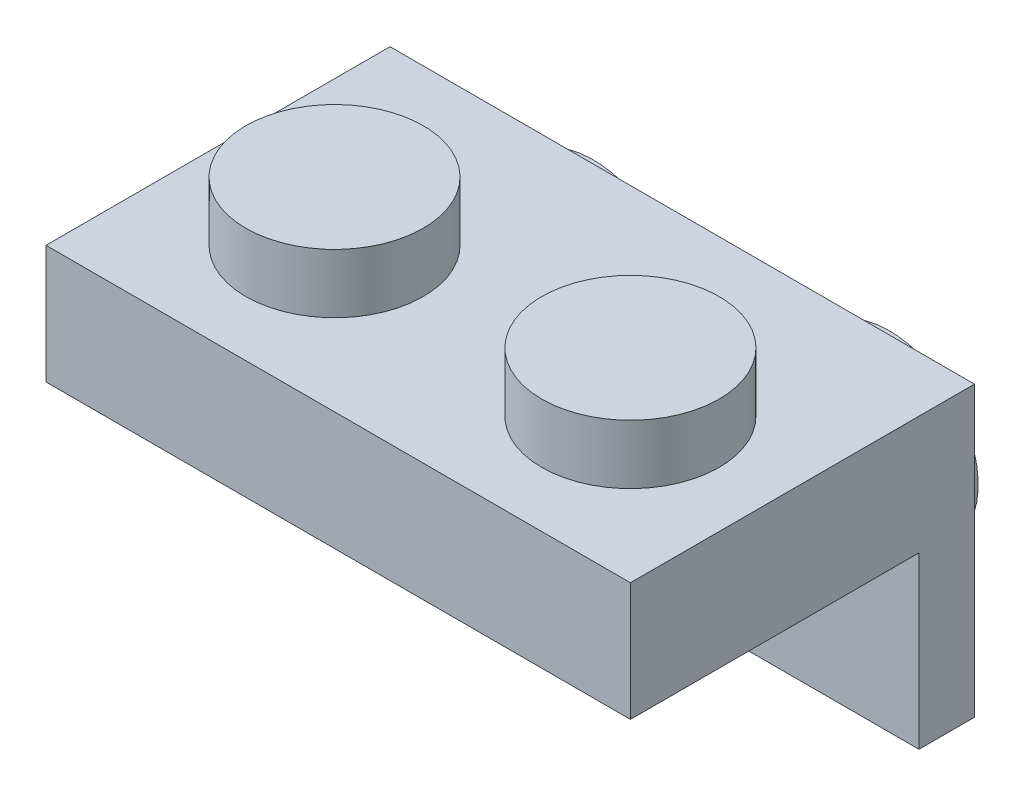
ISO-10303-21;
HEADER;
FILE_DESCRIPTION(('STEP AP214'),'2;1');
FILE_NAME('part.step','',(''),(''),'','','');
FILE_SCHEMA(('AUTOMOTIVE_DESIGN { 1 0 10303 214 1 1 1 1 }'));
ENDSEC;
DATA;
#1=APPLICATION_CONTEXT('core data for automotive mechanical design processes');
#2=APPLICATION_PROTOCOL_DEFINITION('international standard','automotive_design',2000,#1);
#3=PRODUCT_CONTEXT('',#1,'mechanical');
#4=PRODUCT('Part','Part','',(#3));
#5=PRODUCT_RELATED_PRODUCT_CATEGORY('part','',(#4));
#6=PRODUCT_DEFINITION_FORMATION('','',#4);
#7=PRODUCT_DEFINITION_CONTEXT('part definition',#1,'design');
#8=PRODUCT_DEFINITION('design','',#6,#7);
#9=PRODUCT_DEFINITION_SHAPE('','',#8);
#10=(LENGTH_UNIT() NAMED_UNIT(*) SI_UNIT(.MILLI.,.METRE.));
#11=(NAMED_UNIT(*) PLANE_ANGLE_UNIT() SI_UNIT($,.RADIAN.));
#12=(NAMED_UNIT(*) SI_UNIT($,.STERADIAN.) SOLID_ANGLE_UNIT());
#13=UNCERTAINTY_MEASURE_WITH_UNIT(LENGTH_MEASURE(1.E-05),#10,'distance_accuracy_value','');
#14=(GEOMETRIC_REPRESENTATION_CONTEXT(3) GLOBAL_UNCERTAINTY_ASSIGNED_CONTEXT((#13)) GLOBAL_UNIT_ASSIGNED_CONTEXT((#10,
#11,#12)) REPRESENTATION_CONTEXT('',''));
#15=CARTESIAN_POINT('',(0.,0.,0.));
#16=DIRECTION('',(0.,0.,1.));
#17=DIRECTION('',(1.,0.,0.));
#18=AXIS2_PLACEMENT_3D('',#15,#16,#17);
#19=CARTESIAN_POINT('',(0.,0.,-7.8));
#20=DIRECTION('',(0.,-1.,0.));
#21=DIRECTION('',(0.,0.,-1.));
#22=AXIS2_PLACEMENT_3D('',#19,#20,#21);
#23=PLANE('',#22);
#24=DIRECTION('',(1.,0.,0.));
#25=VECTOR('',#24,1.);
#26=CARTESIAN_POINT('',(0.,0.,0.));
#27=LINE('',#26,#25);
#28=CARTESIAN_POINT('',(0.,0.,0.));
#29=VERTEX_POINT('',#28);
#30=CARTESIAN_POINT('',(15.8,0.,0.));
#31=VERTEX_POINT('',#30);
#32=EDGE_CURVE('E109',#29,#31,#27,.T.);
#33=ORIENTED_EDGE('',*,*,#32,.F.);
#34=DIRECTION('',(0.,0.,1.));
#35=VECTOR('',#34,1.);
#36=CARTESIAN_POINT('',(0.,0.,-7.8));
#37=LINE('',#36,#35);
#38=CARTESIAN_POINT('',(0.,0.,-7.8));
#39=VERTEX_POINT('',#38);
#40=EDGE_CURVE('E120',#39,#29,#37,.T.);
#41=ORIENTED_EDGE('',*,*,#40,.F.);
#42=DIRECTION('',(1.,0.,0.));
#43=VECTOR('',#42,1.);
#44=CARTESIAN_POINT('',(0.,0.,-7.8));
#45=LINE('',#44,#43);
#46=CARTESIAN_POINT('',(15.8,0.,-7.8));
#47=VERTEX_POINT('',#46);
#48=EDGE_CURVE('E116',#39,#47,#45,.T.);
#49=ORIENTED_EDGE('',*,*,#48,.T.);
#50=DIRECTION('',(0.,0.,1.));
#51=VECTOR('',#50,1.);
#52=CARTESIAN_POINT('',(15.8,0.,-7.8));
#53=LINE('',#52,#51);
#54=EDGE_CURVE('E101',#47,#31,#53,.T.);
#55=ORIENTED_EDGE('',*,*,#54,.T.);
#56=EDGE_LOOP('',(#33,#41,#49,#55));
#57=FACE_BOUND('',#56,.T.);
#58=DIRECTION('',(0.,0.,1.));
#59=VECTOR('',#58,1.);
#60=CARTESIAN_POINT('',(1.2,0.,-7.8));
#61=LINE('',#60,#59);
#62=CARTESIAN_POINT('',(1.2,0.,-6.6));
#63=VERTEX_POINT('',#62);
#64=CARTESIAN_POINT('',(1.2,0.,-1.2));
#65=VERTEX_POINT('',#64);
#66=EDGE_CURVE('E303',#63,#65,#61,.T.);
#67=ORIENTED_EDGE('',*,*,#66,.T.);
#68=DIRECTION('',(1.,0.,0.));
#69=VECTOR('',#68,1.);
#70=CARTESIAN_POINT('',(0.,0.,-1.2));
#71=LINE('',#70,#69);
#72=CARTESIAN_POINT('',(14.6,0.,-1.2));
#73=VERTEX_POINT('',#72);
#74=EDGE_CURVE('E292',#65,#73,#71,.T.);
#75=ORIENTED_EDGE('',*,*,#74,.T.);
#76=DIRECTION('',(0.,0.,1.));
#77=VECTOR('',#76,1.);
#78=CARTESIAN_POINT('',(14.6,0.,-7.8));
#79=LINE('',#78,#77);
#80=CARTESIAN_POINT('',(14.6,0.,-6.6));
#81=VERTEX_POINT('',#80);
#82=EDGE_CURVE('E298',#81,#73,#79,.T.);
#83=ORIENTED_EDGE('',*,*,#82,.F.);
#84=DIRECTION('',(1.,0.,0.));
#85=VECTOR('',#84,1.);
#86=CARTESIAN_POINT('',(0.,0.,-6.6));
#87=LINE('',#86,#85);
#88=EDGE_CURVE('E57',#63,#81,#87,.T.);
#89=ORIENTED_EDGE('',*,*,#88,.F.);
#90=EDGE_LOOP('',(#67,#75,#83,#89));
#91=FACE_BOUND('',#90,.T.);
#92=ADVANCED_FACE('F41',(#57,#91),#23,.T.);
#93=CARTESIAN_POINT('',(0.,0.,-7.8));
#94=DIRECTION('',(-1.,0.,0.));
#95=DIRECTION('',(0.,0.,1.));
#96=AXIS2_PLACEMENT_3D('',#93,#94,#95);
#97=PLANE('',#96);
#98=DIRECTION('',(0.,-1.,0.));
#99=VECTOR('',#98,1.);
#100=CARTESIAN_POINT('',(0.,0.,0.));
#101=LINE('',#100,#99);
#102=CARTESIAN_POINT('',(0.,3.2,0.));
#103=VERTEX_POINT('',#102);
#104=EDGE_CURVE('E271',#103,#29,#101,.T.);
#105=ORIENTED_EDGE('',*,*,#104,.F.);
#106=DIRECTION('',(0.,0.,1.));
#107=VECTOR('',#106,1.);
#108=CARTESIAN_POINT('',(0.,3.2,-7.8));
#109=LINE('',#108,#107);
#110=CARTESIAN_POINT('',(0.,3.2,-9.3));
#111=VERTEX_POINT('',#110);
#112=EDGE_CURVE('E100',#111,#103,#109,.T.);
#113=ORIENTED_EDGE('',*,*,#112,.F.);
#114=DIRECTION('',(0.,1.,0.));
#115=VECTOR('',#114,1.);
#116=CARTESIAN_POINT('',(0.,-4.6,-9.3));
#117=LINE('',#116,#115);
#118=CARTESIAN_POINT('',(0.,-4.6,-9.3));
#119=VERTEX_POINT('',#118);
#120=EDGE_CURVE('E368',#119,#111,#117,.T.);
#121=ORIENTED_EDGE('',*,*,#120,.F.);
#122=DIRECTION('',(0.,0.,1.));
#123=VECTOR('',#122,1.);
#124=CARTESIAN_POINT('',(0.,-4.6,-9.3));
#125=LINE('',#124,#123);
#126=CARTESIAN_POINT('',(0.,-4.6,-7.8));
#127=VERTEX_POINT('',#126);
#128=EDGE_CURVE('E265',#119,#127,#125,.T.);
#129=ORIENTED_EDGE('',*,*,#128,.T.);
#130=DIRECTION('',(0.,1.,0.));
#131=VECTOR('',#130,1.);
#132=CARTESIAN_POINT('',(0.,-4.6,-7.8));
#133=LINE('',#132,#131);
#134=EDGE_CURVE('E258',#127,#39,#133,.T.);
#135=ORIENTED_EDGE('',*,*,#134,.T.);
#136=ORIENTED_EDGE('',*,*,#40,.T.);
#137=EDGE_LOOP('',(#105,#113,#121,#129,#135,#136));
#138=FACE_BOUND('',#137,.T.);
#139=ADVANCED_FACE('F43',(#138),#97,.T.);
#140=CARTESIAN_POINT('',(0.,3.2,-7.8));
#141=DIRECTION('',(0.,1.,0.));
#142=DIRECTION('',(0.,0.,1.));
#143=AXIS2_PLACEMENT_3D('',#140,#141,#142);
#144=PLANE('',#143);
#145=CARTESIAN_POINT('',(11.9,3.2,-3.9));
#146=DIRECTION('',(0.,1.,0.));
#147=DIRECTION('',(0.,0.,1.));
#148=AXIS2_PLACEMENT_3D('',#145,#146,#147);
#149=CIRCLE('',#148,2.4);
#150=CARTESIAN_POINT('',(11.9,3.2,-1.5));
#151=VERTEX_POINT('',#150);
#152=EDGE_CURVE('E287',#151,#151,#149,.T.);
#153=ORIENTED_EDGE('',*,*,#152,.F.);
#154=EDGE_LOOP('',(#153));
#155=FACE_BOUND('',#154,.T.);
#156=CARTESIAN_POINT('',(3.9,3.2,-3.9));
#157=DIRECTION('',(0.,1.,0.));
#158=DIRECTION('',(0.,0.,1.));
#159=AXIS2_PLACEMENT_3D('',#156,#157,#158);
#160=CIRCLE('',#159,2.4);
#161=CARTESIAN_POINT('',(3.9,3.2,-1.5));
#162=VERTEX_POINT('',#161);
#163=EDGE_CURVE('E277',#162,#162,#160,.T.);
#164=ORIENTED_EDGE('',*,*,#163,.F.);
#165=EDGE_LOOP('',(#164));
#166=FACE_BOUND('',#165,.T.);
#167=DIRECTION('',(-1.,0.,0.));
#168=VECTOR('',#167,1.);
#169=CARTESIAN_POINT('',(0.,3.2,0.));
#170=LINE('',#169,#168);
#171=CARTESIAN_POINT('',(15.8,3.2,0.));
#172=VERTEX_POINT('',#171);
#173=EDGE_CURVE('E107',#172,#103,#170,.T.);
#174=ORIENTED_EDGE('',*,*,#173,.F.);
#175=DIRECTION('',(0.,0.,1.));
#176=VECTOR('',#175,1.);
#177=CARTESIAN_POINT('',(15.8,3.2,-7.8));
#178=LINE('',#177,#176);
#179=CARTESIAN_POINT('',(15.8,3.2,-9.3));
#180=VERTEX_POINT('',#179);
#181=EDGE_CURVE('E86',#180,#172,#178,.T.);
#182=ORIENTED_EDGE('',*,*,#181,.F.);
#183=DIRECTION('',(1.,0.,0.));
#184=VECTOR('',#183,1.);
#185=CARTESIAN_POINT('',(0.,3.2,-9.3));
#186=LINE('',#185,#184);
#187=EDGE_CURVE('E267',#111,#180,#186,.T.);
#188=ORIENTED_EDGE('',*,*,#187,.F.);
#189=ORIENTED_EDGE('',*,*,#112,.T.);
#190=EDGE_LOOP('',(#174,#182,#188,#189));
#191=FACE_BOUND('',#190,.T.);
#192=ADVANCED_FACE('F112',(#155,#166,#191),#144,.T.);
#193=CARTESIAN_POINT('',(15.8,0.,-7.8));
#194=DIRECTION('',(1.,0.,0.));
#195=DIRECTION('',(0.,0.,-1.));
#196=AXIS2_PLACEMENT_3D('',#193,#194,#195);
#197=PLANE('',#196);
#198=DIRECTION('',(0.,1.,0.));
#199=VECTOR('',#198,1.);
#200=CARTESIAN_POINT('',(15.8,0.,0.));
#201=LINE('',#200,#199);
#202=EDGE_CURVE('E89',#31,#172,#201,.T.);
#203=ORIENTED_EDGE('',*,*,#202,.F.);
#204=ORIENTED_EDGE('',*,*,#54,.F.);
#205=DIRECTION('',(0.,-1.,0.));
#206=VECTOR('',#205,1.);
#207=CARTESIAN_POINT('',(15.8,3.2,-7.8));
#208=LINE('',#207,#206);
#209=CARTESIAN_POINT('',(15.8,-4.6,-7.8));
#210=VERTEX_POINT('',#209);
#211=EDGE_CURVE('E66',#47,#210,#208,.T.);
#212=ORIENTED_EDGE('',*,*,#211,.T.);
#213=DIRECTION('',(0.,0.,1.));
#214=VECTOR('',#213,1.);
#215=CARTESIAN_POINT('',(15.8,-4.6,-9.3));
#216=LINE('',#215,#214);
#217=CARTESIAN_POINT('',(15.8,-4.6,-9.3));
#218=VERTEX_POINT('',#217);
#219=EDGE_CURVE('E357',#218,#210,#216,.T.);
#220=ORIENTED_EDGE('',*,*,#219,.F.);
#221=DIRECTION('',(0.,-1.,0.));
#222=VECTOR('',#221,1.);
#223=CARTESIAN_POINT('',(15.8,3.2,-9.3));
#224=LINE('',#223,#222);
#225=EDGE_CURVE('E94',#180,#218,#224,.T.);
#226=ORIENTED_EDGE('',*,*,#225,.F.);
#227=ORIENTED_EDGE('',*,*,#181,.T.);
#228=EDGE_LOOP('',(#203,#204,#212,#220,#226,#227));
#229=FACE_BOUND('',#228,.T.);
#230=ADVANCED_FACE('F88',(#229),#197,.T.);
#231=CARTESIAN_POINT('',(0.,0.,0.));
#232=DIRECTION('',(0.,0.,-1.));
#233=DIRECTION('',(-1.,0.,0.));
#234=AXIS2_PLACEMENT_3D('',#231,#232,#233);
#235=PLANE('',#234);
#236=ORIENTED_EDGE('',*,*,#104,.T.);
#237=ORIENTED_EDGE('',*,*,#32,.T.);
#238=ORIENTED_EDGE('',*,*,#202,.T.);
#239=ORIENTED_EDGE('',*,*,#173,.T.);
#240=EDGE_LOOP('',(#236,#237,#238,#239));
#241=FACE_BOUND('',#240,.T.);
#242=ADVANCED_FACE('F106',(#241),#235,.F.);
#243=CARTESIAN_POINT('',(3.9,4.8,-3.9));
#244=DIRECTION('',(0.,-1.,0.));
#245=DIRECTION('',(0.,0.,-1.));
#246=AXIS2_PLACEMENT_3D('',#243,#244,#245);
#247=CYLINDRICAL_SURFACE('',#246,2.4);
#248=CARTESIAN_POINT('',(3.9,4.8,-3.9));
#249=DIRECTION('',(0.,1.,0.));
#250=DIRECTION('',(0.,0.,1.));
#251=AXIS2_PLACEMENT_3D('',#248,#249,#250);
#252=CIRCLE('',#251,2.4);
#253=CARTESIAN_POINT('',(3.9,4.8,-1.5));
#254=VERTEX_POINT('',#253);
#255=EDGE_CURVE('E273',#254,#254,#252,.T.);
#256=ORIENTED_EDGE('',*,*,#255,.F.);
#257=EDGE_LOOP('',(#256));
#258=FACE_BOUND('',#257,.T.);
#259=ORIENTED_EDGE('',*,*,#163,.T.);
#260=EDGE_LOOP('',(#259));
#261=FACE_BOUND('',#260,.T.);
#262=ADVANCED_FACE('F181',(#258,#261),#247,.T.);
#263=CARTESIAN_POINT('',(3.9,4.8,-3.9));
#264=DIRECTION('',(0.,1.,0.));
#265=DIRECTION('',(0.,0.,1.));
#266=AXIS2_PLACEMENT_3D('',#263,#264,#265);
#267=PLANE('',#266);
#268=ORIENTED_EDGE('',*,*,#255,.T.);
#269=EDGE_LOOP('',(#268));
#270=FACE_BOUND('',#269,.T.);
#271=ADVANCED_FACE('F184',(#270),#267,.T.);
#272=CARTESIAN_POINT('',(11.9,4.8,-3.9));
#273=DIRECTION('',(0.,-1.,0.));
#274=DIRECTION('',(0.,0.,-1.));
#275=AXIS2_PLACEMENT_3D('',#272,#273,#274);
#276=CYLINDRICAL_SURFACE('',#275,2.4);
#277=CARTESIAN_POINT('',(11.9,4.8,-3.9));
#278=DIRECTION('',(0.,1.,0.));
#279=DIRECTION('',(0.,0.,1.));
#280=AXIS2_PLACEMENT_3D('',#277,#278,#279);
#281=CIRCLE('',#280,2.4);
#282=CARTESIAN_POINT('',(11.9,4.8,-1.5));
#283=VERTEX_POINT('',#282);
#284=EDGE_CURVE('E282',#283,#283,#281,.T.);
#285=ORIENTED_EDGE('',*,*,#284,.F.);
#286=EDGE_LOOP('',(#285));
#287=FACE_BOUND('',#286,.T.);
#288=ORIENTED_EDGE('',*,*,#152,.T.);
#289=EDGE_LOOP('',(#288));
#290=FACE_BOUND('',#289,.T.);
#291=ADVANCED_FACE('F188',(#287,#290),#276,.T.);
#292=CARTESIAN_POINT('',(11.9,4.8,-3.9));
#293=DIRECTION('',(0.,1.,0.));
#294=DIRECTION('',(0.,0.,1.));
#295=AXIS2_PLACEMENT_3D('',#292,#293,#294);
#296=PLANE('',#295);
#297=ORIENTED_EDGE('',*,*,#284,.T.);
#298=EDGE_LOOP('',(#297));
#299=FACE_BOUND('',#298,.T.);
#300=ADVANCED_FACE('F192',(#299),#296,.T.);
#301=CARTESIAN_POINT('',(1.2,0.,-7.8));
#302=DIRECTION('',(-1.,0.,0.));
#303=DIRECTION('',(0.,0.,1.));
#304=AXIS2_PLACEMENT_3D('',#301,#302,#303);
#305=PLANE('',#304);
#306=DIRECTION('',(0.,-1.,0.));
#307=VECTOR('',#306,1.);
#308=CARTESIAN_POINT('',(1.2,0.,-1.2));
#309=LINE('',#308,#307);
#310=CARTESIAN_POINT('',(1.2,2.,-1.2));
#311=VERTEX_POINT('',#310);
#312=EDGE_CURVE('E297',#311,#65,#309,.T.);
#313=ORIENTED_EDGE('',*,*,#312,.T.);
#314=ORIENTED_EDGE('',*,*,#66,.F.);
#315=DIRECTION('',(0.,-1.,0.));
#316=VECTOR('',#315,1.);
#317=CARTESIAN_POINT('',(1.2,0.,-6.6));
#318=LINE('',#317,#316);
#319=CARTESIAN_POINT('',(1.2,2.,-6.6));
#320=VERTEX_POINT('',#319);
#321=EDGE_CURVE('E307',#320,#63,#318,.T.);
#322=ORIENTED_EDGE('',*,*,#321,.F.);
#323=DIRECTION('',(0.,0.,1.));
#324=VECTOR('',#323,1.);
#325=CARTESIAN_POINT('',(1.2,2.,-7.8));
#326=LINE('',#325,#324);
#327=EDGE_CURVE('E291',#320,#311,#326,.T.);
#328=ORIENTED_EDGE('',*,*,#327,.T.);
#329=EDGE_LOOP('',(#313,#314,#322,#328));
#330=FACE_BOUND('',#329,.T.);
#331=ADVANCED_FACE('F196',(#330),#305,.F.);
#332=CARTESIAN_POINT('',(0.,2.,-7.8));
#333=DIRECTION('',(0.,1.,0.));
#334=DIRECTION('',(0.,0.,1.));
#335=AXIS2_PLACEMENT_3D('',#332,#333,#334);
#336=PLANE('',#335);
#337=CARTESIAN_POINT('',(7.9,2.,-3.9));
#338=DIRECTION('',(0.,1.,0.));
#339=DIRECTION('',(0.,0.,1.));
#340=AXIS2_PLACEMENT_3D('',#337,#338,#339);
#341=CIRCLE('',#340,1.5);
#342=CARTESIAN_POINT('',(7.9,2.,-2.4));
#343=VERTEX_POINT('',#342);
#344=EDGE_CURVE('E125',#343,#343,#341,.F.);
#345=ORIENTED_EDGE('',*,*,#344,.F.);
#346=EDGE_LOOP('',(#345));
#347=FACE_BOUND('',#346,.T.);
#348=CARTESIAN_POINT('',(11.9,2.,-3.9));
#349=DIRECTION('',(0.,1.,0.));
#350=DIRECTION('',(0.,0.,1.));
#351=AXIS2_PLACEMENT_3D('',#348,#349,#350);
#352=CIRCLE('',#351,1.2);
#353=CARTESIAN_POINT('',(11.9,2.,-2.7));
#354=VERTEX_POINT('',#353);
#355=EDGE_CURVE('E317',#354,#354,#352,.T.);
#356=ORIENTED_EDGE('',*,*,#355,.T.);
#357=EDGE_LOOP('',(#356));
#358=FACE_BOUND('',#357,.T.);
#359=CARTESIAN_POINT('',(3.9,2.,-3.9));
#360=DIRECTION('',(0.,1.,0.));
#361=DIRECTION('',(0.,0.,1.));
#362=AXIS2_PLACEMENT_3D('',#359,#360,#361);
#363=CIRCLE('',#362,1.2);
#364=CARTESIAN_POINT('',(3.9,2.,-2.7));
#365=VERTEX_POINT('',#364);
#366=EDGE_CURVE('E316',#365,#365,#363,.T.);
#367=ORIENTED_EDGE('',*,*,#366,.T.);
#368=EDGE_LOOP('',(#367));
#369=FACE_BOUND('',#368,.T.);
#370=DIRECTION('',(-1.,0.,0.));
#371=VECTOR('',#370,1.);
#372=CARTESIAN_POINT('',(0.,2.,-1.2));
#373=LINE('',#372,#371);
#374=CARTESIAN_POINT('',(14.6,2.,-1.2));
#375=VERTEX_POINT('',#374);
#376=EDGE_CURVE('E327',#375,#311,#373,.T.);
#377=ORIENTED_EDGE('',*,*,#376,.T.);
#378=ORIENTED_EDGE('',*,*,#327,.F.);
#379=DIRECTION('',(-1.,0.,0.));
#380=VECTOR('',#379,1.);
#381=CARTESIAN_POINT('',(0.,2.,-6.6));
#382=LINE('',#381,#380);
#383=CARTESIAN_POINT('',(14.6,2.,-6.6));
#384=VERTEX_POINT('',#383);
#385=EDGE_CURVE('E311',#384,#320,#382,.T.);
#386=ORIENTED_EDGE('',*,*,#385,.F.);
#387=DIRECTION('',(0.,0.,1.));
#388=VECTOR('',#387,1.);
#389=CARTESIAN_POINT('',(14.6,2.,-7.8));
#390=LINE('',#389,#388);
#391=EDGE_CURVE('E302',#384,#375,#390,.T.);
#392=ORIENTED_EDGE('',*,*,#391,.T.);
#393=EDGE_LOOP('',(#377,#378,#386,#392));
#394=FACE_BOUND('',#393,.T.);
#395=ADVANCED_FACE('F225',(#347,#358,#369,#394),#336,.F.);
#396=CARTESIAN_POINT('',(14.6,0.,-7.8));
#397=DIRECTION('',(1.,0.,0.));
#398=DIRECTION('',(0.,0.,-1.));
#399=AXIS2_PLACEMENT_3D('',#396,#397,#398);
#400=PLANE('',#399);
#401=DIRECTION('',(0.,1.,0.));
#402=VECTOR('',#401,1.);
#403=CARTESIAN_POINT('',(14.6,0.,-1.2));
#404=LINE('',#403,#402);
#405=EDGE_CURVE('E296',#73,#375,#404,.T.);
#406=ORIENTED_EDGE('',*,*,#405,.T.);
#407=ORIENTED_EDGE('',*,*,#391,.F.);
#408=DIRECTION('',(0.,1.,0.));
#409=VECTOR('',#408,1.);
#410=CARTESIAN_POINT('',(14.6,0.,-6.6));
#411=LINE('',#410,#409);
#412=EDGE_CURVE('E306',#81,#384,#411,.T.);
#413=ORIENTED_EDGE('',*,*,#412,.F.);
#414=ORIENTED_EDGE('',*,*,#82,.T.);
#415=EDGE_LOOP('',(#406,#407,#413,#414));
#416=FACE_BOUND('',#415,.T.);
#417=ADVANCED_FACE('F222',(#416),#400,.F.);
#418=CARTESIAN_POINT('',(0.,0.,-6.6));
#419=DIRECTION('',(0.,0.,-1.));
#420=DIRECTION('',(-1.,0.,0.));
#421=AXIS2_PLACEMENT_3D('',#418,#419,#420);
#422=PLANE('',#421);
#423=ORIENTED_EDGE('',*,*,#321,.T.);
#424=ORIENTED_EDGE('',*,*,#88,.T.);
#425=ORIENTED_EDGE('',*,*,#412,.T.);
#426=ORIENTED_EDGE('',*,*,#385,.T.);
#427=EDGE_LOOP('',(#423,#424,#425,#426));
#428=FACE_BOUND('',#427,.T.);
#429=ADVANCED_FACE('F218',(#428),#422,.F.);
#430=CARTESIAN_POINT('',(0.,0.,-1.2));
#431=DIRECTION('',(0.,0.,-1.));
#432=DIRECTION('',(-1.,0.,0.));
#433=AXIS2_PLACEMENT_3D('',#430,#431,#432);
#434=PLANE('',#433);
#435=ORIENTED_EDGE('',*,*,#312,.F.);
#436=ORIENTED_EDGE('',*,*,#376,.F.);
#437=ORIENTED_EDGE('',*,*,#405,.F.);
#438=ORIENTED_EDGE('',*,*,#74,.F.);
#439=EDGE_LOOP('',(#435,#436,#437,#438));
#440=FACE_BOUND('',#439,.T.);
#441=ADVANCED_FACE('F214',(#440),#434,.T.);
#442=CARTESIAN_POINT('',(3.9,4.8,-3.9));
#443=DIRECTION('',(0.,-1.,0.));
#444=DIRECTION('',(0.,0.,-1.));
#445=AXIS2_PLACEMENT_3D('',#442,#443,#444);
#446=CYLINDRICAL_SURFACE('',#445,1.2);
#447=CARTESIAN_POINT('',(3.9,3.6,-3.9));
#448=DIRECTION('',(0.,1.,0.));
#449=DIRECTION('',(0.,0.,1.));
#450=AXIS2_PLACEMENT_3D('',#447,#448,#449);
#451=CIRCLE('',#450,1.2);
#452=CARTESIAN_POINT('',(3.9,3.6,-2.7));
#453=VERTEX_POINT('',#452);
#454=EDGE_CURVE('E318',#453,#453,#451,.T.);
#455=ORIENTED_EDGE('',*,*,#454,.T.);
#456=EDGE_LOOP('',(#455));
#457=FACE_BOUND('',#456,.T.);
#458=ORIENTED_EDGE('',*,*,#366,.F.);
#459=EDGE_LOOP('',(#458));
#460=FACE_BOUND('',#459,.T.);
#461=ADVANCED_FACE('F210',(#457,#460),#446,.F.);
#462=CARTESIAN_POINT('',(3.9,3.6,-3.9));
#463=DIRECTION('',(0.,1.,0.));
#464=DIRECTION('',(0.,0.,1.));
#465=AXIS2_PLACEMENT_3D('',#462,#463,#464);
#466=PLANE('',#465);
#467=ORIENTED_EDGE('',*,*,#454,.F.);
#468=EDGE_LOOP('',(#467));
#469=FACE_BOUND('',#468,.T.);
#470=ADVANCED_FACE('F206',(#469),#466,.F.);
#471=CARTESIAN_POINT('',(11.9,4.8,-3.9));
#472=DIRECTION('',(0.,-1.,0.));
#473=DIRECTION('',(0.,0.,-1.));
#474=AXIS2_PLACEMENT_3D('',#471,#472,#473);
#475=CYLINDRICAL_SURFACE('',#474,1.2);
#476=CARTESIAN_POINT('',(11.9,3.6,-3.9));
#477=DIRECTION('',(0.,1.,0.));
#478=DIRECTION('',(0.,0.,1.));
#479=AXIS2_PLACEMENT_3D('',#476,#477,#478);
#480=CIRCLE('',#479,1.2);
#481=CARTESIAN_POINT('',(11.9,3.6,-2.7));
#482=VERTEX_POINT('',#481);
#483=EDGE_CURVE('E312',#482,#482,#480,.T.);
#484=ORIENTED_EDGE('',*,*,#483,.T.);
#485=EDGE_LOOP('',(#484));
#486=FACE_BOUND('',#485,.T.);
#487=ORIENTED_EDGE('',*,*,#355,.F.);
#488=EDGE_LOOP('',(#487));
#489=FACE_BOUND('',#488,.T.);
#490=ADVANCED_FACE('F202',(#486,#489),#475,.F.);
#491=CARTESIAN_POINT('',(11.9,3.6,-3.9));
#492=DIRECTION('',(0.,1.,0.));
#493=DIRECTION('',(0.,0.,1.));
#494=AXIS2_PLACEMENT_3D('',#491,#492,#493);
#495=PLANE('',#494);
#496=ORIENTED_EDGE('',*,*,#483,.F.);
#497=EDGE_LOOP('',(#496));
#498=FACE_BOUND('',#497,.T.);
#499=ADVANCED_FACE('F198',(#498),#495,.F.);
#500=CARTESIAN_POINT('',(7.9,-4.24264068711929,-3.9));
#501=DIRECTION('',(0.,1.,0.));
#502=DIRECTION('',(0.,0.,1.));
#503=AXIS2_PLACEMENT_3D('',#500,#501,#502);
#504=CYLINDRICAL_SURFACE('',#503,1.5);
#505=ORIENTED_EDGE('',*,*,#344,.T.);
#506=EDGE_LOOP('',(#505));
#507=FACE_BOUND('',#506,.T.);
#508=CARTESIAN_POINT('',(7.9,0.2,-3.9));
#509=DIRECTION('',(0.,-1.,0.));
#510=DIRECTION('',(0.,0.,-1.));
#511=AXIS2_PLACEMENT_3D('',#508,#509,#510);
#512=CIRCLE('',#511,1.5);
#513=CARTESIAN_POINT('',(7.9,0.2,-5.4));
#514=VERTEX_POINT('',#513);
#515=EDGE_CURVE('E343',#514,#514,#512,.T.);
#516=ORIENTED_EDGE('',*,*,#515,.F.);
#517=EDGE_LOOP('',(#516));
#518=FACE_BOUND('',#517,.T.);
#519=ADVANCED_FACE('F201',(#507,#518),#504,.T.);
#520=CARTESIAN_POINT('',(7.9,-4.24264068711929,-3.9));
#521=DIRECTION('',(0.,1.,0.));
#522=DIRECTION('',(0.,0.,1.));
#523=AXIS2_PLACEMENT_3D('',#520,#521,#522);
#524=CYLINDRICAL_SURFACE('',#523,0.6);
#525=CARTESIAN_POINT('',(7.9,2.,-3.9));
#526=DIRECTION('',(0.,-1.,0.));
#527=DIRECTION('',(0.,0.,-1.));
#528=AXIS2_PLACEMENT_3D('',#525,#526,#527);
#529=CIRCLE('',#528,0.6);
#530=CARTESIAN_POINT('',(7.9,2.,-4.5));
#531=VERTEX_POINT('',#530);
#532=EDGE_CURVE('E356',#531,#531,#529,.T.);
#533=ORIENTED_EDGE('',*,*,#532,.F.);
#534=EDGE_LOOP('',(#533));
#535=FACE_BOUND('',#534,.T.);
#536=CARTESIAN_POINT('',(7.9,0.2,-3.9));
#537=DIRECTION('',(0.,-1.,0.));
#538=DIRECTION('',(0.,0.,-1.));
#539=AXIS2_PLACEMENT_3D('',#536,#537,#538);
#540=CIRCLE('',#539,0.6);
#541=CARTESIAN_POINT('',(7.9,0.2,-4.5));
#542=VERTEX_POINT('',#541);
#543=EDGE_CURVE('E352',#542,#542,#540,.T.);
#544=ORIENTED_EDGE('',*,*,#543,.T.);
#545=EDGE_LOOP('',(#544));
#546=FACE_BOUND('',#545,.T.);
#547=ADVANCED_FACE('F236',(#535,#546),#524,.F.);
#548=CARTESIAN_POINT('',(0.,0.2,-7.8));
#549=DIRECTION('',(0.,-1.,0.));
#550=DIRECTION('',(0.,0.,-1.));
#551=AXIS2_PLACEMENT_3D('',#548,#549,#550);
#552=PLANE('',#551);
#553=ORIENTED_EDGE('',*,*,#543,.F.);
#554=EDGE_LOOP('',(#553));
#555=FACE_BOUND('',#554,.T.);
#556=ORIENTED_EDGE('',*,*,#515,.T.);
#557=EDGE_LOOP('',(#556));
#558=FACE_BOUND('',#557,.T.);
#559=ADVANCED_FACE('F240',(#555,#558),#552,.T.);
#560=ORIENTED_EDGE('',*,*,#532,.T.);
#561=EDGE_LOOP('',(#560));
#562=FACE_BOUND('',#561,.T.);
#563=ADVANCED_FACE('F230',(#562),#336,.F.);
#564=CARTESIAN_POINT('',(15.8,-4.6,-9.3));
#565=DIRECTION('',(0.,1.,0.));
#566=DIRECTION('',(-1.,0.,0.));
#567=AXIS2_PLACEMENT_3D('',#564,#565,#566);
#568=PLANE('',#567);
#569=DIRECTION('',(-1.,0.,0.));
#570=VECTOR('',#569,1.);
#571=CARTESIAN_POINT('',(15.8,-4.6,-7.8));
#572=LINE('',#571,#570);
#573=EDGE_CURVE('E268',#210,#127,#572,.T.);
#574=ORIENTED_EDGE('',*,*,#573,.T.);
#575=ORIENTED_EDGE('',*,*,#128,.F.);
#576=DIRECTION('',(-1.,0.,0.));
#577=VECTOR('',#576,1.);
#578=CARTESIAN_POINT('',(15.8,-4.6,-9.3));
#579=LINE('',#578,#577);
#580=EDGE_CURVE('E379',#218,#119,#579,.T.);
#581=ORIENTED_EDGE('',*,*,#580,.F.);
#582=ORIENTED_EDGE('',*,*,#219,.T.);
#583=EDGE_LOOP('',(#574,#575,#581,#582));
#584=FACE_BOUND('',#583,.T.);
#585=ADVANCED_FACE('F159',(#584),#568,.F.);
#586=CARTESIAN_POINT('',(0.,0.,-9.3));
#587=DIRECTION('',(0.,0.,-1.));
#588=DIRECTION('',(-1.,0.,0.));
#589=AXIS2_PLACEMENT_3D('',#586,#587,#588);
#590=PLANE('',#589);
#591=CARTESIAN_POINT('',(11.9,-0.699999999999997,-9.3));
#592=DIRECTION('',(0.,0.,-1.));
#593=DIRECTION('',(-1.,0.,0.));
#594=AXIS2_PLACEMENT_3D('',#591,#592,#593);
#595=CIRCLE('',#594,2.4);
#596=CARTESIAN_POINT('',(9.5,-0.699999999999997,-9.3));
#597=VERTEX_POINT('',#596);
#598=EDGE_CURVE('E399',#597,#597,#595,.T.);
#599=ORIENTED_EDGE('',*,*,#598,.F.);
#600=EDGE_LOOP('',(#599));
#601=FACE_BOUND('',#600,.T.);
#602=CARTESIAN_POINT('',(3.9,-0.699999999999997,-9.3));
#603=DIRECTION('',(0.,0.,-1.));
#604=DIRECTION('',(-1.,0.,0.));
#605=AXIS2_PLACEMENT_3D('',#602,#603,#604);
#606=CIRCLE('',#605,2.4);
#607=CARTESIAN_POINT('',(1.5,-0.699999999999997,-9.3));
#608=VERTEX_POINT('',#607);
#609=EDGE_CURVE('E387',#608,#608,#606,.T.);
#610=ORIENTED_EDGE('',*,*,#609,.F.);
#611=EDGE_LOOP('',(#610));
#612=FACE_BOUND('',#611,.T.);
#613=ORIENTED_EDGE('',*,*,#187,.T.);
#614=ORIENTED_EDGE('',*,*,#225,.T.);
#615=ORIENTED_EDGE('',*,*,#580,.T.);
#616=ORIENTED_EDGE('',*,*,#120,.T.);
#617=EDGE_LOOP('',(#613,#614,#615,#616));
#618=FACE_BOUND('',#617,.T.);
#619=ADVANCED_FACE('F143',(#601,#612,#618),#590,.T.);
#620=CARTESIAN_POINT('',(0.,0.,-7.8));
#621=DIRECTION('',(0.,0.,-1.));
#622=DIRECTION('',(-1.,0.,0.));
#623=AXIS2_PLACEMENT_3D('',#620,#621,#622);
#624=PLANE('',#623);
#625=ORIENTED_EDGE('',*,*,#48,.F.);
#626=ORIENTED_EDGE('',*,*,#134,.F.);
#627=ORIENTED_EDGE('',*,*,#573,.F.);
#628=ORIENTED_EDGE('',*,*,#211,.F.);
#629=EDGE_LOOP('',(#625,#626,#627,#628));
#630=FACE_BOUND('',#629,.T.);
#631=ADVANCED_FACE('F158',(#630),#624,.F.);
#632=CARTESIAN_POINT('',(3.9,-0.699999999999997,-10.9));
#633=DIRECTION('',(0.,0.,-1.));
#634=DIRECTION('',(-1.,0.,0.));
#635=AXIS2_PLACEMENT_3D('',#632,#633,#634);
#636=PLANE('',#635);
#637=CARTESIAN_POINT('',(3.9,-0.699999999999997,-10.9));
#638=DIRECTION('',(0.,0.,-1.));
#639=DIRECTION('',(-1.,0.,0.));
#640=AXIS2_PLACEMENT_3D('',#637,#638,#639);
#641=CIRCLE('',#640,2.4);
#642=CARTESIAN_POINT('',(1.5,-0.699999999999997,-10.9));
#643=VERTEX_POINT('',#642);
#644=EDGE_CURVE('E375',#643,#643,#641,.T.);
#645=ORIENTED_EDGE('',*,*,#644,.T.);
#646=EDGE_LOOP('',(#645));
#647=FACE_BOUND('',#646,.T.);
#648=CARTESIAN_POINT('',(3.9,-0.699999999999997,-10.9));
#649=DIRECTION('',(0.,0.,-1.));
#650=DIRECTION('',(-1.,0.,0.));
#651=AXIS2_PLACEMENT_3D('',#648,#649,#650);
#652=CIRCLE('',#651,1.55);
#653=CARTESIAN_POINT('',(2.35,-0.699999999999997,-10.9));
#654=VERTEX_POINT('',#653);
#655=EDGE_CURVE('E391',#654,#654,#652,.T.);
#656=ORIENTED_EDGE('',*,*,#655,.F.);
#657=EDGE_LOOP('',(#656));
#658=FACE_BOUND('',#657,.T.);
#659=ADVANCED_FACE('F248',(#647,#658),#636,.T.);
#660=CARTESIAN_POINT('',(3.9,-0.699999999999997,-10.9));
#661=DIRECTION('',(0.,0.,1.));
#662=DIRECTION('',(1.,0.,0.));
#663=AXIS2_PLACEMENT_3D('',#660,#661,#662);
#664=CYLINDRICAL_SURFACE('',#663,2.4);
#665=ORIENTED_EDGE('',*,*,#644,.F.);
#666=EDGE_LOOP('',(#665));
#667=FACE_BOUND('',#666,.T.);
#668=ORIENTED_EDGE('',*,*,#609,.T.);
#669=EDGE_LOOP('',(#668));
#670=FACE_BOUND('',#669,.T.);
#671=ADVANCED_FACE('F152',(#667,#670),#664,.T.);
#672=CARTESIAN_POINT('',(3.9,-0.699999999999997,-10.9));
#673=DIRECTION('',(0.,0.,1.));
#674=DIRECTION('',(1.,0.,0.));
#675=AXIS2_PLACEMENT_3D('',#672,#673,#674);
#676=CYLINDRICAL_SURFACE('',#675,1.55);
#677=ORIENTED_EDGE('',*,*,#655,.T.);
#678=EDGE_LOOP('',(#677));
#679=FACE_BOUND('',#678,.T.);
#680=CARTESIAN_POINT('',(3.9,-0.699999999999997,-9.3));
#681=DIRECTION('',(0.,0.,-1.));
#682=DIRECTION('',(-1.,0.,0.));
#683=AXIS2_PLACEMENT_3D('',#680,#681,#682);
#684=CIRCLE('',#683,1.55);
#685=CARTESIAN_POINT('',(2.35,-0.699999999999997,-9.3));
#686=VERTEX_POINT('',#685);
#687=EDGE_CURVE('E50',#686,#686,#684,.F.);
#688=ORIENTED_EDGE('',*,*,#687,.T.);
#689=EDGE_LOOP('',(#688));
#690=FACE_BOUND('',#689,.T.);
#691=ADVANCED_FACE('F137',(#679,#690),#676,.F.);
#692=ORIENTED_EDGE('',*,*,#687,.F.);
#693=EDGE_LOOP('',(#692));
#694=FACE_BOUND('',#693,.T.);
#695=ADVANCED_FACE('F139',(#694),#590,.T.);
#696=CARTESIAN_POINT('',(11.9,-0.699999999999997,-10.9));
#697=DIRECTION('',(0.,0.,-1.));
#698=DIRECTION('',(-1.,0.,0.));
#699=AXIS2_PLACEMENT_3D('',#696,#697,#698);
#700=PLANE('',#699);
#701=CARTESIAN_POINT('',(11.9,-0.699999999999997,-10.9));
#702=DIRECTION('',(0.,0.,-1.));
#703=DIRECTION('',(-1.,0.,0.));
#704=AXIS2_PLACEMENT_3D('',#701,#702,#703);
#705=CIRCLE('',#704,2.4);
#706=CARTESIAN_POINT('',(9.5,-0.699999999999997,-10.9));
#707=VERTEX_POINT('',#706);
#708=EDGE_CURVE('E398',#707,#707,#705,.T.);
#709=ORIENTED_EDGE('',*,*,#708,.T.);
#710=EDGE_LOOP('',(#709));
#711=FACE_BOUND('',#710,.T.);
#712=CARTESIAN_POINT('',(11.9,-0.699999999999997,-10.9));
#713=DIRECTION('',(0.,0.,-1.));
#714=DIRECTION('',(-1.,0.,0.));
#715=AXIS2_PLACEMENT_3D('',#712,#713,#714);
#716=CIRCLE('',#715,1.55);
#717=CARTESIAN_POINT('',(10.35,-0.699999999999997,-10.9));
#718=VERTEX_POINT('',#717);
#719=EDGE_CURVE('E403',#718,#718,#716,.T.);
#720=ORIENTED_EDGE('',*,*,#719,.F.);
#721=EDGE_LOOP('',(#720));
#722=FACE_BOUND('',#721,.T.);
#723=ADVANCED_FACE('F141',(#711,#722),#700,.T.);
#724=CARTESIAN_POINT('',(11.9,-0.699999999999997,-10.9));
#725=DIRECTION('',(0.,0.,1.));
#726=DIRECTION('',(1.,0.,0.));
#727=AXIS2_PLACEMENT_3D('',#724,#725,#726);
#728=CYLINDRICAL_SURFACE('',#727,2.4);
#729=ORIENTED_EDGE('',*,*,#708,.F.);
#730=EDGE_LOOP('',(#729));
#731=FACE_BOUND('',#730,.T.);
#732=ORIENTED_EDGE('',*,*,#598,.T.);
#733=EDGE_LOOP('',(#732));
#734=FACE_BOUND('',#733,.T.);
#735=ADVANCED_FACE('F149',(#731,#734),#728,.T.);
#736=CARTESIAN_POINT('',(11.9,-0.699999999999997,-10.9));
#737=DIRECTION('',(0.,0.,1.));
#738=DIRECTION('',(1.,0.,0.));
#739=AXIS2_PLACEMENT_3D('',#736,#737,#738);
#740=CYLINDRICAL_SURFACE('',#739,1.55);
#741=ORIENTED_EDGE('',*,*,#719,.T.);
#742=EDGE_LOOP('',(#741));
#743=FACE_BOUND('',#742,.T.);
#744=CARTESIAN_POINT('',(11.9,-0.699999999999997,-9.3));
#745=DIRECTION('',(0.,0.,-1.));
#746=DIRECTION('',(-1.,0.,0.));
#747=AXIS2_PLACEMENT_3D('',#744,#745,#746);
#748=CIRCLE('',#747,1.55);
#749=CARTESIAN_POINT('',(10.35,-0.699999999999997,-9.3));
#750=VERTEX_POINT('',#749);
#751=EDGE_CURVE('E12',#750,#750,#748,.F.);
#752=ORIENTED_EDGE('',*,*,#751,.T.);
#753=EDGE_LOOP('',(#752));
#754=FACE_BOUND('',#753,.T.);
#755=ADVANCED_FACE('F162',(#743,#754),#740,.F.);
#756=ORIENTED_EDGE('',*,*,#751,.F.);
#757=EDGE_LOOP('',(#756));
#758=FACE_BOUND('',#757,.T.);
#759=ADVANCED_FACE('F144',(#758),#590,.T.);
#760=CLOSED_SHELL('',(#92,#139,#192,#230,#242,#262,#271,#291,#300,#331,#395,#417,#429,#441,#461,
#470,#490,#499,#519,#547,#559,#563,#585,#619,#631,#659,#671,#691,#695,#723,#735,#755,#759));
#761=MANIFOLD_SOLID_BREP('B2',#760);
#762=ADVANCED_BREP_SHAPE_REPRESENTATION('',(#18,#761),#14);
#763=SHAPE_DEFINITION_REPRESENTATION(#9,#762);
ENDSEC;
END-ISO-10303-21;
